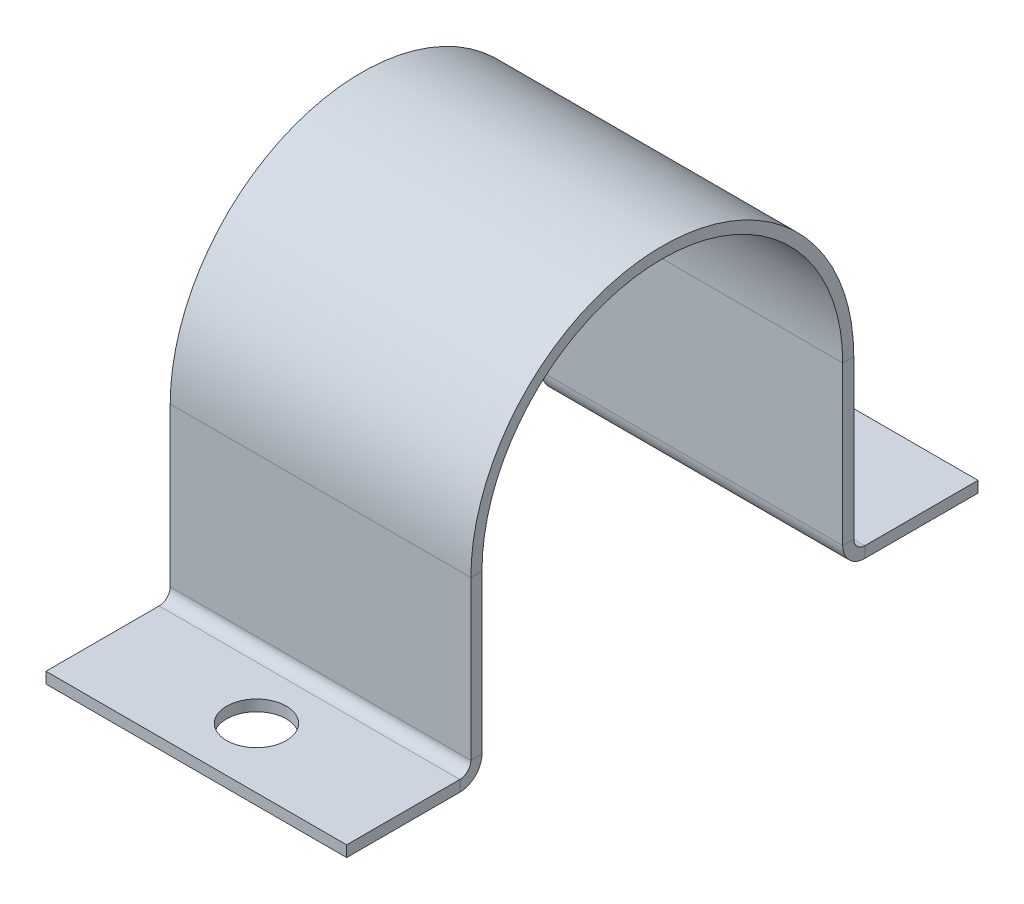
ISO-10303-21;
HEADER;
FILE_DESCRIPTION(('STEP AP214'),'2;1');
FILE_NAME('part.step','',(''),(''),'','','');
FILE_SCHEMA(('AUTOMOTIVE_DESIGN { 1 0 10303 214 1 1 1 1 }'));
ENDSEC;
DATA;
#1=APPLICATION_CONTEXT('core data for automotive mechanical design processes');
#2=APPLICATION_PROTOCOL_DEFINITION('international standard','automotive_design',2000,#1);
#3=PRODUCT_CONTEXT('',#1,'mechanical');
#4=PRODUCT('Part','Part','',(#3));
#5=PRODUCT_RELATED_PRODUCT_CATEGORY('part','',(#4));
#6=PRODUCT_DEFINITION_FORMATION('','',#4);
#7=PRODUCT_DEFINITION_CONTEXT('part definition',#1,'design');
#8=PRODUCT_DEFINITION('design','',#6,#7);
#9=PRODUCT_DEFINITION_SHAPE('','',#8);
#10=(LENGTH_UNIT() NAMED_UNIT(*) SI_UNIT(.MILLI.,.METRE.));
#11=(NAMED_UNIT(*) PLANE_ANGLE_UNIT() SI_UNIT($,.RADIAN.));
#12=(NAMED_UNIT(*) SI_UNIT($,.STERADIAN.) SOLID_ANGLE_UNIT());
#13=UNCERTAINTY_MEASURE_WITH_UNIT(LENGTH_MEASURE(1.E-05),#10,'distance_accuracy_value','');
#14=(GEOMETRIC_REPRESENTATION_CONTEXT(3) GLOBAL_UNCERTAINTY_ASSIGNED_CONTEXT((#13)) GLOBAL_UNIT_ASSIGNED_CONTEXT((#10,
#11,#12)) REPRESENTATION_CONTEXT('',''));
#15=CARTESIAN_POINT('',(0.,0.,0.));
#16=DIRECTION('',(0.,0.,1.));
#17=DIRECTION('',(1.,0.,0.));
#18=AXIS2_PLACEMENT_3D('',#15,#16,#17);
#19=CARTESIAN_POINT('',(10.,0.,-12.));
#20=DIRECTION('',(0.,1.,0.));
#21=DIRECTION('',(0.,0.,1.));
#22=AXIS2_PLACEMENT_3D('',#19,#20,#21);
#23=PLANE('',#22);
#24=DIRECTION('',(0.,0.,-1.));
#25=VECTOR('',#24,1.);
#26=CARTESIAN_POINT('',(-10.,0.,-12.));
#27=LINE('',#26,#25);
#28=CARTESIAN_POINT('',(-10.,0.,-13.4732));
#29=VERTEX_POINT('',#28);
#30=CARTESIAN_POINT('',(-10.,0.,-21.));
#31=VERTEX_POINT('',#30);
#32=EDGE_CURVE('E199',#29,#31,#27,.T.);
#33=ORIENTED_EDGE('',*,*,#32,.T.);
#34=DIRECTION('',(-1.,0.,0.));
#35=VECTOR('',#34,1.);
#36=CARTESIAN_POINT('',(10.,0.,-21.));
#37=LINE('',#36,#35);
#38=CARTESIAN_POINT('',(10.,0.,-21.));
#39=VERTEX_POINT('',#38);
#40=EDGE_CURVE('E276',#39,#31,#37,.T.);
#41=ORIENTED_EDGE('',*,*,#40,.F.);
#42=DIRECTION('',(0.,0.,-1.));
#43=VECTOR('',#42,1.);
#44=CARTESIAN_POINT('',(10.,0.,-12.));
#45=LINE('',#44,#43);
#46=CARTESIAN_POINT('',(10.,0.,-13.4732));
#47=VERTEX_POINT('',#46);
#48=EDGE_CURVE('E121',#47,#39,#45,.T.);
#49=ORIENTED_EDGE('',*,*,#48,.F.);
#50=DIRECTION('',(-1.,0.,0.));
#51=VECTOR('',#50,1.);
#52=CARTESIAN_POINT('',(10.,0.,-13.4732));
#53=LINE('',#52,#51);
#54=EDGE_CURVE('E195',#47,#29,#53,.T.);
#55=ORIENTED_EDGE('',*,*,#54,.T.);
#56=EDGE_LOOP('',(#33,#41,#49,#55));
#57=FACE_BOUND('',#56,.T.);
#58=CARTESIAN_POINT('',(0.,0.,-17.));
#59=DIRECTION('',(0.,-1.,0.));
#60=DIRECTION('',(0.,0.,-1.));
#61=AXIS2_PLACEMENT_3D('',#58,#59,#60);
#62=CIRCLE('',#61,1.984375);
#63=CARTESIAN_POINT('',(0.,0.,-18.984375));
#64=VERTEX_POINT('',#63);
#65=EDGE_CURVE('E729',#64,#64,#62,.T.);
#66=ORIENTED_EDGE('',*,*,#65,.F.);
#67=EDGE_LOOP('',(#66));
#68=FACE_BOUND('',#67,.T.);
#69=ADVANCED_FACE('F38',(#57,#68),#23,.F.);
#70=CARTESIAN_POINT('',(10.,0.736600000000001,-12.));
#71=DIRECTION('',(0.,1.,0.));
#72=DIRECTION('',(0.,0.,1.));
#73=AXIS2_PLACEMENT_3D('',#70,#71,#72);
#74=PLANE('',#73);
#75=DIRECTION('',(0.,0.,-1.));
#76=VECTOR('',#75,1.);
#77=CARTESIAN_POINT('',(-10.,0.736600000000001,-12.));
#78=LINE('',#77,#76);
#79=CARTESIAN_POINT('',(-10.,0.7366,-13.4732));
#80=VERTEX_POINT('',#79);
#81=CARTESIAN_POINT('',(-10.,0.7366,-21.));
#82=VERTEX_POINT('',#81);
#83=EDGE_CURVE('E206',#80,#82,#78,.T.);
#84=ORIENTED_EDGE('',*,*,#83,.F.);
#85=DIRECTION('',(-1.,0.,0.));
#86=VECTOR('',#85,1.);
#87=CARTESIAN_POINT('',(10.,0.7366,-13.4732));
#88=LINE('',#87,#86);
#89=CARTESIAN_POINT('',(10.,0.7366,-13.4732));
#90=VERTEX_POINT('',#89);
#91=EDGE_CURVE('E271',#90,#80,#88,.T.);
#92=ORIENTED_EDGE('',*,*,#91,.F.);
#93=DIRECTION('',(0.,0.,-1.));
#94=VECTOR('',#93,1.);
#95=CARTESIAN_POINT('',(10.,0.736600000000001,-12.));
#96=LINE('',#95,#94);
#97=CARTESIAN_POINT('',(10.,0.7366,-21.));
#98=VERTEX_POINT('',#97);
#99=EDGE_CURVE('E720',#90,#98,#96,.T.);
#100=ORIENTED_EDGE('',*,*,#99,.T.);
#101=DIRECTION('',(-1.,0.,0.));
#102=VECTOR('',#101,1.);
#103=CARTESIAN_POINT('',(10.,0.7366,-21.));
#104=LINE('',#103,#102);
#105=EDGE_CURVE('E274',#98,#82,#104,.T.);
#106=ORIENTED_EDGE('',*,*,#105,.T.);
#107=EDGE_LOOP('',(#84,#92,#100,#106));
#108=FACE_BOUND('',#107,.T.);
#109=CARTESIAN_POINT('',(0.,0.7366,-17.));
#110=DIRECTION('',(0.,-1.,0.));
#111=DIRECTION('',(0.,0.,-1.));
#112=AXIS2_PLACEMENT_3D('',#109,#110,#111);
#113=CIRCLE('',#112,1.984375);
#114=CARTESIAN_POINT('',(0.,0.7366,-18.984375));
#115=VERTEX_POINT('',#114);
#116=EDGE_CURVE('E732',#115,#115,#113,.T.);
#117=ORIENTED_EDGE('',*,*,#116,.T.);
#118=EDGE_LOOP('',(#117));
#119=FACE_BOUND('',#118,.T.);
#120=ADVANCED_FACE('F388',(#108,#119),#74,.T.);
#121=CARTESIAN_POINT('',(10.,12.,12.));
#122=DIRECTION('',(1.,0.,0.));
#123=DIRECTION('',(0.,0.,-1.));
#124=AXIS2_PLACEMENT_3D('',#121,#122,#123);
#125=PLANE('',#124);
#126=DIRECTION('',(0.,0.,1.));
#127=VECTOR('',#126,1.);
#128=CARTESIAN_POINT('',(10.,12.,12.));
#129=LINE('',#128,#127);
#130=CARTESIAN_POINT('',(10.,12.,12.));
#131=VERTEX_POINT('',#130);
#132=CARTESIAN_POINT('',(10.,12.,12.7366));
#133=VERTEX_POINT('',#132);
#134=EDGE_CURVE('E11',#131,#133,#129,.T.);
#135=ORIENTED_EDGE('',*,*,#134,.F.);
#136=CARTESIAN_POINT('',(10.,12.,0.));
#137=DIRECTION('',(-1.,0.,0.));
#138=DIRECTION('',(0.,0.,1.));
#139=AXIS2_PLACEMENT_3D('',#136,#137,#138);
#140=CIRCLE('',#139,12.);
#141=CARTESIAN_POINT('',(10.,12.,-12.));
#142=VERTEX_POINT('',#141);
#143=EDGE_CURVE('E173',#131,#142,#140,.T.);
#144=ORIENTED_EDGE('',*,*,#143,.T.);
#145=DIRECTION('',(0.,0.,1.));
#146=VECTOR('',#145,1.);
#147=CARTESIAN_POINT('',(10.,12.,-12.7366));
#148=LINE('',#147,#146);
#149=CARTESIAN_POINT('',(10.,12.,-12.7366));
#150=VERTEX_POINT('',#149);
#151=EDGE_CURVE('E47',#150,#142,#148,.T.);
#152=ORIENTED_EDGE('',*,*,#151,.F.);
#153=CARTESIAN_POINT('',(10.,12.,0.));
#154=DIRECTION('',(1.,0.,0.));
#155=DIRECTION('',(0.,0.,-1.));
#156=AXIS2_PLACEMENT_3D('',#153,#154,#155);
#157=CIRCLE('',#156,12.7366);
#158=EDGE_CURVE('E300',#133,#150,#157,.F.);
#159=ORIENTED_EDGE('',*,*,#158,.F.);
#160=EDGE_LOOP('',(#135,#144,#152,#159));
#161=FACE_BOUND('',#160,.T.);
#162=ADVANCED_FACE('F40',(#161),#125,.T.);
#163=CARTESIAN_POINT('',(10.,12.,-12.7366));
#164=DIRECTION('',(1.,0.,0.));
#165=DIRECTION('',(0.,0.,-1.));
#166=AXIS2_PLACEMENT_3D('',#163,#164,#165);
#167=PLANE('',#166);
#168=DIRECTION('',(0.,1.,0.));
#169=VECTOR('',#168,1.);
#170=CARTESIAN_POINT('',(10.,0.,12.));
#171=LINE('',#170,#169);
#172=CARTESIAN_POINT('',(10.,1.4732,12.));
#173=VERTEX_POINT('',#172);
#174=EDGE_CURVE('E178',#173,#131,#171,.T.);
#175=ORIENTED_EDGE('',*,*,#174,.T.);
#176=ORIENTED_EDGE('',*,*,#134,.T.);
#177=DIRECTION('',(0.,1.,0.));
#178=VECTOR('',#177,1.);
#179=CARTESIAN_POINT('',(10.,0.,12.7366));
#180=LINE('',#179,#178);
#181=CARTESIAN_POINT('',(10.,1.4732,12.7366));
#182=VERTEX_POINT('',#181);
#183=EDGE_CURVE('E314',#182,#133,#180,.T.);
#184=ORIENTED_EDGE('',*,*,#183,.F.);
#185=DIRECTION('',(0.,0.,-1.));
#186=VECTOR('',#185,1.);
#187=CARTESIAN_POINT('',(10.,1.4732,12.7366));
#188=LINE('',#187,#186);
#189=EDGE_CURVE('E287',#182,#173,#188,.T.);
#190=ORIENTED_EDGE('',*,*,#189,.T.);
#191=EDGE_LOOP('',(#175,#176,#184,#190));
#192=FACE_BOUND('',#191,.T.);
#193=ADVANCED_FACE('F338',(#192),#167,.T.);
#194=CARTESIAN_POINT('',(-10.,12.,-12.));
#195=DIRECTION('',(-1.,0.,0.));
#196=DIRECTION('',(0.,0.,1.));
#197=AXIS2_PLACEMENT_3D('',#194,#195,#196);
#198=PLANE('',#197);
#199=DIRECTION('',(0.,0.,-1.));
#200=VECTOR('',#199,1.);
#201=CARTESIAN_POINT('',(-10.,12.,-12.));
#202=LINE('',#201,#200);
#203=CARTESIAN_POINT('',(-10.,12.,-12.));
#204=VERTEX_POINT('',#203);
#205=CARTESIAN_POINT('',(-10.,12.,-12.7366));
#206=VERTEX_POINT('',#205);
#207=EDGE_CURVE('E171',#204,#206,#202,.T.);
#208=ORIENTED_EDGE('',*,*,#207,.F.);
#209=CARTESIAN_POINT('',(-10.,12.,0.));
#210=DIRECTION('',(-1.,0.,0.));
#211=DIRECTION('',(0.,0.,1.));
#212=AXIS2_PLACEMENT_3D('',#209,#210,#211);
#213=CIRCLE('',#212,12.);
#214=CARTESIAN_POINT('',(-10.,12.,12.));
#215=VERTEX_POINT('',#214);
#216=EDGE_CURVE('E185',#215,#204,#213,.T.);
#217=ORIENTED_EDGE('',*,*,#216,.F.);
#218=DIRECTION('',(0.,0.,-1.));
#219=VECTOR('',#218,1.);
#220=CARTESIAN_POINT('',(-10.,12.,12.7366));
#221=LINE('',#220,#219);
#222=CARTESIAN_POINT('',(-10.,12.,12.7366));
#223=VERTEX_POINT('',#222);
#224=EDGE_CURVE('E291',#223,#215,#221,.T.);
#225=ORIENTED_EDGE('',*,*,#224,.F.);
#226=CARTESIAN_POINT('',(-10.,12.,0.));
#227=DIRECTION('',(1.,0.,0.));
#228=DIRECTION('',(0.,0.,-1.));
#229=AXIS2_PLACEMENT_3D('',#226,#227,#228);
#230=CIRCLE('',#229,12.7366);
#231=EDGE_CURVE('E213',#223,#206,#230,.F.);
#232=ORIENTED_EDGE('',*,*,#231,.T.);
#233=EDGE_LOOP('',(#208,#217,#225,#232));
#234=FACE_BOUND('',#233,.T.);
#235=ADVANCED_FACE('F305',(#234),#198,.T.);
#236=CARTESIAN_POINT('',(-10.,12.,12.7366));
#237=DIRECTION('',(-1.,0.,0.));
#238=DIRECTION('',(0.,0.,1.));
#239=AXIS2_PLACEMENT_3D('',#236,#237,#238);
#240=PLANE('',#239);
#241=DIRECTION('',(0.,-1.,0.));
#242=VECTOR('',#241,1.);
#243=CARTESIAN_POINT('',(-10.,12.,-12.));
#244=LINE('',#243,#242);
#245=CARTESIAN_POINT('',(-10.,1.4732,-12.));
#246=VERTEX_POINT('',#245);
#247=EDGE_CURVE('E238',#204,#246,#244,.T.);
#248=ORIENTED_EDGE('',*,*,#247,.F.);
#249=ORIENTED_EDGE('',*,*,#207,.T.);
#250=DIRECTION('',(0.,-1.,0.));
#251=VECTOR('',#250,1.);
#252=CARTESIAN_POINT('',(-10.,12.,-12.7366));
#253=LINE('',#252,#251);
#254=CARTESIAN_POINT('',(-10.,1.4732,-12.7366));
#255=VERTEX_POINT('',#254);
#256=EDGE_CURVE('E211',#206,#255,#253,.T.);
#257=ORIENTED_EDGE('',*,*,#256,.T.);
#258=DIRECTION('',(0.,0.,1.));
#259=VECTOR('',#258,1.);
#260=CARTESIAN_POINT('',(-10.,1.4732,-12.7366));
#261=LINE('',#260,#259);
#262=EDGE_CURVE('E108',#255,#246,#261,.T.);
#263=ORIENTED_EDGE('',*,*,#262,.T.);
#264=EDGE_LOOP('',(#248,#249,#257,#263));
#265=FACE_BOUND('',#264,.T.);
#266=ADVANCED_FACE('F293',(#265),#240,.T.);
#267=CARTESIAN_POINT('',(10.,0.,13.4732));
#268=DIRECTION('',(1.,0.,0.));
#269=DIRECTION('',(0.,0.,-1.));
#270=AXIS2_PLACEMENT_3D('',#267,#268,#269);
#271=PLANE('',#270);
#272=DIRECTION('',(0.,1.,0.));
#273=VECTOR('',#272,1.);
#274=CARTESIAN_POINT('',(10.,0.,13.4732));
#275=LINE('',#274,#273);
#276=CARTESIAN_POINT('',(10.,0.,13.4732));
#277=VERTEX_POINT('',#276);
#278=CARTESIAN_POINT('',(10.,0.7366,13.4732));
#279=VERTEX_POINT('',#278);
#280=EDGE_CURVE('E289',#277,#279,#275,.T.);
#281=ORIENTED_EDGE('',*,*,#280,.F.);
#282=CARTESIAN_POINT('',(10.,1.4732,13.4732));
#283=DIRECTION('',(-1.,0.,0.));
#284=DIRECTION('',(0.,0.,1.));
#285=AXIS2_PLACEMENT_3D('',#282,#283,#284);
#286=CIRCLE('',#285,1.4732);
#287=EDGE_CURVE('E333',#277,#173,#286,.F.);
#288=ORIENTED_EDGE('',*,*,#287,.T.);
#289=ORIENTED_EDGE('',*,*,#189,.F.);
#290=CARTESIAN_POINT('',(10.,1.4732,13.4732));
#291=DIRECTION('',(1.,0.,0.));
#292=DIRECTION('',(0.,0.,-1.));
#293=AXIS2_PLACEMENT_3D('',#290,#291,#292);
#294=CIRCLE('',#293,0.7366);
#295=EDGE_CURVE('E316',#279,#182,#294,.T.);
#296=ORIENTED_EDGE('',*,*,#295,.F.);
#297=EDGE_LOOP('',(#281,#288,#289,#296));
#298=FACE_BOUND('',#297,.T.);
#299=ADVANCED_FACE('F351',(#298),#271,.T.);
#300=CARTESIAN_POINT('',(10.,1.4732,12.7366));
#301=DIRECTION('',(1.,0.,0.));
#302=DIRECTION('',(0.,0.,-1.));
#303=AXIS2_PLACEMENT_3D('',#300,#301,#302);
#304=PLANE('',#303);
#305=DIRECTION('',(0.,0.,-1.));
#306=VECTOR('',#305,1.);
#307=CARTESIAN_POINT('',(10.,0.,21.));
#308=LINE('',#307,#306);
#309=CARTESIAN_POINT('',(10.,0.,21.));
#310=VERTEX_POINT('',#309);
#311=EDGE_CURVE('E330',#310,#277,#308,.T.);
#312=ORIENTED_EDGE('',*,*,#311,.T.);
#313=ORIENTED_EDGE('',*,*,#280,.T.);
#314=DIRECTION('',(0.,0.,-1.));
#315=VECTOR('',#314,1.);
#316=CARTESIAN_POINT('',(10.,0.7366,21.));
#317=LINE('',#316,#315);
#318=CARTESIAN_POINT('',(10.,0.7366,21.));
#319=VERTEX_POINT('',#318);
#320=EDGE_CURVE('E324',#319,#279,#317,.T.);
#321=ORIENTED_EDGE('',*,*,#320,.F.);
#322=DIRECTION('',(0.,1.,0.));
#323=VECTOR('',#322,1.);
#324=CARTESIAN_POINT('',(10.,0.,21.));
#325=LINE('',#324,#323);
#326=EDGE_CURVE('E327',#310,#319,#325,.T.);
#327=ORIENTED_EDGE('',*,*,#326,.F.);
#328=EDGE_LOOP('',(#312,#313,#321,#327));
#329=FACE_BOUND('',#328,.T.);
#330=ADVANCED_FACE('F358',(#329),#304,.T.);
#331=CARTESIAN_POINT('',(-10.,1.4732,12.));
#332=DIRECTION('',(-1.,0.,0.));
#333=DIRECTION('',(0.,0.,1.));
#334=AXIS2_PLACEMENT_3D('',#331,#332,#333);
#335=PLANE('',#334);
#336=DIRECTION('',(0.,0.,1.));
#337=VECTOR('',#336,1.);
#338=CARTESIAN_POINT('',(-10.,1.4732,12.));
#339=LINE('',#338,#337);
#340=CARTESIAN_POINT('',(-10.,1.4732,12.));
#341=VERTEX_POINT('',#340);
#342=CARTESIAN_POINT('',(-10.,1.4732,12.7366));
#343=VERTEX_POINT('',#342);
#344=EDGE_CURVE('E285',#341,#343,#339,.T.);
#345=ORIENTED_EDGE('',*,*,#344,.F.);
#346=CARTESIAN_POINT('',(-10.,1.4732,13.4732));
#347=DIRECTION('',(-1.,0.,0.));
#348=DIRECTION('',(0.,0.,1.));
#349=AXIS2_PLACEMENT_3D('',#346,#347,#348);
#350=CIRCLE('',#349,1.4732);
#351=CARTESIAN_POINT('',(-10.,0.,13.4732));
#352=VERTEX_POINT('',#351);
#353=EDGE_CURVE('E231',#352,#341,#350,.F.);
#354=ORIENTED_EDGE('',*,*,#353,.F.);
#355=DIRECTION('',(0.,-1.,0.));
#356=VECTOR('',#355,1.);
#357=CARTESIAN_POINT('',(-10.,0.7366,13.4732));
#358=LINE('',#357,#356);
#359=CARTESIAN_POINT('',(-10.,0.7366,13.4732));
#360=VERTEX_POINT('',#359);
#361=EDGE_CURVE('E283',#360,#352,#358,.T.);
#362=ORIENTED_EDGE('',*,*,#361,.F.);
#363=CARTESIAN_POINT('',(-10.,1.4732,13.4732));
#364=DIRECTION('',(1.,0.,0.));
#365=DIRECTION('',(0.,0.,-1.));
#366=AXIS2_PLACEMENT_3D('',#363,#364,#365);
#367=CIRCLE('',#366,0.7366);
#368=EDGE_CURVE('E219',#360,#343,#367,.T.);
#369=ORIENTED_EDGE('',*,*,#368,.T.);
#370=EDGE_LOOP('',(#345,#354,#362,#369));
#371=FACE_BOUND('',#370,.T.);
#372=ADVANCED_FACE('F370',(#371),#335,.T.);
#373=CARTESIAN_POINT('',(-10.,0.7366,13.4732));
#374=DIRECTION('',(-1.,0.,0.));
#375=DIRECTION('',(0.,0.,1.));
#376=AXIS2_PLACEMENT_3D('',#373,#374,#375);
#377=PLANE('',#376);
#378=DIRECTION('',(0.,1.,0.));
#379=VECTOR('',#378,1.);
#380=CARTESIAN_POINT('',(-10.,0.,12.));
#381=LINE('',#380,#379);
#382=EDGE_CURVE('E234',#341,#215,#381,.T.);
#383=ORIENTED_EDGE('',*,*,#382,.F.);
#384=ORIENTED_EDGE('',*,*,#344,.T.);
#385=DIRECTION('',(0.,1.,0.));
#386=VECTOR('',#385,1.);
#387=CARTESIAN_POINT('',(-10.,0.,12.7366));
#388=LINE('',#387,#386);
#389=EDGE_CURVE('E216',#343,#223,#388,.T.);
#390=ORIENTED_EDGE('',*,*,#389,.T.);
#391=ORIENTED_EDGE('',*,*,#224,.T.);
#392=EDGE_LOOP('',(#383,#384,#390,#391));
#393=FACE_BOUND('',#392,.T.);
#394=ADVANCED_FACE('F342',(#393),#377,.T.);
#395=CARTESIAN_POINT('',(10.,1.4732,-12.));
#396=DIRECTION('',(1.,0.,0.));
#397=DIRECTION('',(0.,0.,-1.));
#398=AXIS2_PLACEMENT_3D('',#395,#396,#397);
#399=PLANE('',#398);
#400=DIRECTION('',(0.,0.,-1.));
#401=VECTOR('',#400,1.);
#402=CARTESIAN_POINT('',(10.,1.4732,-12.));
#403=LINE('',#402,#401);
#404=CARTESIAN_POINT('',(10.,1.4732,-12.));
#405=VERTEX_POINT('',#404);
#406=CARTESIAN_POINT('',(10.,1.4732,-12.7366));
#407=VERTEX_POINT('',#406);
#408=EDGE_CURVE('E281',#405,#407,#403,.T.);
#409=ORIENTED_EDGE('',*,*,#408,.F.);
#410=CARTESIAN_POINT('',(10.,1.4732,-13.4732));
#411=DIRECTION('',(-1.,0.,0.));
#412=DIRECTION('',(0.,0.,1.));
#413=AXIS2_PLACEMENT_3D('',#410,#411,#412);
#414=CIRCLE('',#413,1.4732);
#415=EDGE_CURVE('E193',#405,#47,#414,.F.);
#416=ORIENTED_EDGE('',*,*,#415,.T.);
#417=DIRECTION('',(0.,-1.,0.));
#418=VECTOR('',#417,1.);
#419=CARTESIAN_POINT('',(10.,0.7366,-13.4732));
#420=LINE('',#419,#418);
#421=EDGE_CURVE('E55',#90,#47,#420,.T.);
#422=ORIENTED_EDGE('',*,*,#421,.F.);
#423=CARTESIAN_POINT('',(10.,1.4732,-13.4732));
#424=DIRECTION('',(1.,0.,0.));
#425=DIRECTION('',(0.,0.,-1.));
#426=AXIS2_PLACEMENT_3D('',#423,#424,#425);
#427=CIRCLE('',#426,0.7366);
#428=EDGE_CURVE('E318',#407,#90,#427,.T.);
#429=ORIENTED_EDGE('',*,*,#428,.F.);
#430=EDGE_LOOP('',(#409,#416,#422,#429));
#431=FACE_BOUND('',#430,.T.);
#432=ADVANCED_FACE('F409',(#431),#399,.T.);
#433=CARTESIAN_POINT('',(10.,0.7366,-13.4732));
#434=DIRECTION('',(1.,0.,0.));
#435=DIRECTION('',(0.,0.,-1.));
#436=AXIS2_PLACEMENT_3D('',#433,#434,#435);
#437=PLANE('',#436);
#438=DIRECTION('',(0.,-1.,0.));
#439=VECTOR('',#438,1.);
#440=CARTESIAN_POINT('',(10.,12.,-12.));
#441=LINE('',#440,#439);
#442=EDGE_CURVE('E163',#142,#405,#441,.T.);
#443=ORIENTED_EDGE('',*,*,#442,.T.);
#444=ORIENTED_EDGE('',*,*,#408,.T.);
#445=DIRECTION('',(0.,-1.,0.));
#446=VECTOR('',#445,1.);
#447=CARTESIAN_POINT('',(10.,12.,-12.7366));
#448=LINE('',#447,#446);
#449=EDGE_CURVE('E166',#150,#407,#448,.T.);
#450=ORIENTED_EDGE('',*,*,#449,.F.);
#451=ORIENTED_EDGE('',*,*,#151,.T.);
#452=EDGE_LOOP('',(#443,#444,#450,#451));
#453=FACE_BOUND('',#452,.T.);
#454=ADVANCED_FACE('F161',(#453),#437,.T.);
#455=CARTESIAN_POINT('',(-10.,0.,-13.4732));
#456=DIRECTION('',(-1.,0.,0.));
#457=DIRECTION('',(0.,0.,1.));
#458=AXIS2_PLACEMENT_3D('',#455,#456,#457);
#459=PLANE('',#458);
#460=DIRECTION('',(0.,1.,0.));
#461=VECTOR('',#460,1.);
#462=CARTESIAN_POINT('',(-10.,0.,-13.4732));
#463=LINE('',#462,#461);
#464=EDGE_CURVE('E115',#29,#80,#463,.T.);
#465=ORIENTED_EDGE('',*,*,#464,.F.);
#466=CARTESIAN_POINT('',(-10.,1.4732,-13.4732));
#467=DIRECTION('',(-1.,0.,0.));
#468=DIRECTION('',(0.,0.,1.));
#469=AXIS2_PLACEMENT_3D('',#466,#467,#468);
#470=CIRCLE('',#469,1.4732);
#471=EDGE_CURVE('E240',#246,#29,#470,.F.);
#472=ORIENTED_EDGE('',*,*,#471,.F.);
#473=ORIENTED_EDGE('',*,*,#262,.F.);
#474=CARTESIAN_POINT('',(-10.,1.4732,-13.4732));
#475=DIRECTION('',(1.,0.,0.));
#476=DIRECTION('',(0.,0.,-1.));
#477=AXIS2_PLACEMENT_3D('',#474,#475,#476);
#478=CIRCLE('',#477,0.7366);
#479=EDGE_CURVE('E209',#255,#80,#478,.T.);
#480=ORIENTED_EDGE('',*,*,#479,.T.);
#481=EDGE_LOOP('',(#465,#472,#473,#480));
#482=FACE_BOUND('',#481,.T.);
#483=ADVANCED_FACE('F403',(#482),#459,.T.);
#484=CARTESIAN_POINT('',(-10.,1.4732,-12.7366));
#485=DIRECTION('',(-1.,0.,0.));
#486=DIRECTION('',(0.,0.,1.));
#487=AXIS2_PLACEMENT_3D('',#484,#485,#486);
#488=PLANE('',#487);
#489=ORIENTED_EDGE('',*,*,#32,.F.);
#490=ORIENTED_EDGE('',*,*,#464,.T.);
#491=ORIENTED_EDGE('',*,*,#83,.T.);
#492=DIRECTION('',(0.,-1.,0.));
#493=VECTOR('',#492,1.);
#494=CARTESIAN_POINT('',(-10.,0.7366,-21.));
#495=LINE('',#494,#493);
#496=EDGE_CURVE('E202',#82,#31,#495,.T.);
#497=ORIENTED_EDGE('',*,*,#496,.T.);
#498=EDGE_LOOP('',(#489,#490,#491,#497));
#499=FACE_BOUND('',#498,.T.);
#500=ADVANCED_FACE('F400',(#499),#488,.T.);
#501=CARTESIAN_POINT('',(10.,0.7366,-21.));
#502=DIRECTION('',(0.,0.,-1.));
#503=DIRECTION('',(-1.,0.,0.));
#504=AXIS2_PLACEMENT_3D('',#501,#502,#503);
#505=PLANE('',#504);
#506=ORIENTED_EDGE('',*,*,#496,.F.);
#507=ORIENTED_EDGE('',*,*,#105,.F.);
#508=DIRECTION('',(0.,-1.,0.));
#509=VECTOR('',#508,1.);
#510=CARTESIAN_POINT('',(10.,0.7366,-21.));
#511=LINE('',#510,#509);
#512=EDGE_CURVE('E721',#98,#39,#511,.T.);
#513=ORIENTED_EDGE('',*,*,#512,.T.);
#514=ORIENTED_EDGE('',*,*,#40,.T.);
#515=EDGE_LOOP('',(#506,#507,#513,#514));
#516=FACE_BOUND('',#515,.T.);
#517=ADVANCED_FACE('F399',(#516),#505,.T.);
#518=CARTESIAN_POINT('',(10.,1.4732,-13.4732));
#519=DIRECTION('',(-1.,0.,0.));
#520=DIRECTION('',(0.,0.,1.));
#521=AXIS2_PLACEMENT_3D('',#518,#519,#520);
#522=CYLINDRICAL_SURFACE('',#521,0.7366);
#523=ORIENTED_EDGE('',*,*,#479,.F.);
#524=DIRECTION('',(-1.,0.,0.));
#525=VECTOR('',#524,1.);
#526=CARTESIAN_POINT('',(10.,1.4732,-12.7366));
#527=LINE('',#526,#525);
#528=EDGE_CURVE('E268',#407,#255,#527,.T.);
#529=ORIENTED_EDGE('',*,*,#528,.F.);
#530=ORIENTED_EDGE('',*,*,#428,.T.);
#531=ORIENTED_EDGE('',*,*,#91,.T.);
#532=EDGE_LOOP('',(#523,#529,#530,#531));
#533=FACE_BOUND('',#532,.T.);
#534=ADVANCED_FACE('F580',(#533),#522,.F.);
#535=CARTESIAN_POINT('',(10.,12.,-12.7366));
#536=DIRECTION('',(0.,0.,-1.));
#537=DIRECTION('',(0.,1.,0.));
#538=AXIS2_PLACEMENT_3D('',#535,#536,#537);
#539=PLANE('',#538);
#540=ORIENTED_EDGE('',*,*,#256,.F.);
#541=DIRECTION('',(-1.,0.,0.));
#542=VECTOR('',#541,1.);
#543=CARTESIAN_POINT('',(10.,12.,-12.7366));
#544=LINE('',#543,#542);
#545=EDGE_CURVE('E265',#150,#206,#544,.T.);
#546=ORIENTED_EDGE('',*,*,#545,.F.);
#547=ORIENTED_EDGE('',*,*,#449,.T.);
#548=ORIENTED_EDGE('',*,*,#528,.T.);
#549=EDGE_LOOP('',(#540,#546,#547,#548));
#550=FACE_BOUND('',#549,.T.);
#551=ADVANCED_FACE('F302',(#550),#539,.T.);
#552=CARTESIAN_POINT('',(10.,12.,0.));
#553=DIRECTION('',(-1.,0.,0.));
#554=DIRECTION('',(0.,0.,1.));
#555=AXIS2_PLACEMENT_3D('',#552,#553,#554);
#556=CYLINDRICAL_SURFACE('',#555,12.7366);
#557=ORIENTED_EDGE('',*,*,#231,.F.);
#558=DIRECTION('',(-1.,0.,0.));
#559=VECTOR('',#558,1.);
#560=CARTESIAN_POINT('',(10.,12.,12.7366));
#561=LINE('',#560,#559);
#562=EDGE_CURVE('E262',#133,#223,#561,.T.);
#563=ORIENTED_EDGE('',*,*,#562,.F.);
#564=ORIENTED_EDGE('',*,*,#158,.T.);
#565=ORIENTED_EDGE('',*,*,#545,.T.);
#566=EDGE_LOOP('',(#557,#563,#564,#565));
#567=FACE_BOUND('',#566,.T.);
#568=ADVANCED_FACE('F298',(#567),#556,.T.);
#569=CARTESIAN_POINT('',(10.,0.,12.7366));
#570=DIRECTION('',(0.,0.,1.));
#571=DIRECTION('',(0.,-1.,0.));
#572=AXIS2_PLACEMENT_3D('',#569,#570,#571);
#573=PLANE('',#572);
#574=ORIENTED_EDGE('',*,*,#389,.F.);
#575=DIRECTION('',(-1.,0.,0.));
#576=VECTOR('',#575,1.);
#577=CARTESIAN_POINT('',(10.,1.4732,12.7366));
#578=LINE('',#577,#576);
#579=EDGE_CURVE('E259',#182,#343,#578,.T.);
#580=ORIENTED_EDGE('',*,*,#579,.F.);
#581=ORIENTED_EDGE('',*,*,#183,.T.);
#582=ORIENTED_EDGE('',*,*,#562,.T.);
#583=EDGE_LOOP('',(#574,#580,#581,#582));
#584=FACE_BOUND('',#583,.T.);
#585=ADVANCED_FACE('F311',(#584),#573,.T.);
#586=CARTESIAN_POINT('',(10.,1.4732,13.4732));
#587=DIRECTION('',(-1.,0.,0.));
#588=DIRECTION('',(0.,0.,1.));
#589=AXIS2_PLACEMENT_3D('',#586,#587,#588);
#590=CYLINDRICAL_SURFACE('',#589,0.7366);
#591=ORIENTED_EDGE('',*,*,#368,.F.);
#592=DIRECTION('',(-1.,0.,0.));
#593=VECTOR('',#592,1.);
#594=CARTESIAN_POINT('',(10.,0.7366,13.4732));
#595=LINE('',#594,#593);
#596=EDGE_CURVE('E256',#279,#360,#595,.T.);
#597=ORIENTED_EDGE('',*,*,#596,.F.);
#598=ORIENTED_EDGE('',*,*,#295,.T.);
#599=ORIENTED_EDGE('',*,*,#579,.T.);
#600=EDGE_LOOP('',(#591,#597,#598,#599));
#601=FACE_BOUND('',#600,.T.);
#602=ADVANCED_FACE('F347',(#601),#590,.F.);
#603=CARTESIAN_POINT('',(10.,0.7366,21.));
#604=DIRECTION('',(0.,1.,0.));
#605=DIRECTION('',(0.,0.,1.));
#606=AXIS2_PLACEMENT_3D('',#603,#604,#605);
#607=PLANE('',#606);
#608=CARTESIAN_POINT('',(0.,0.7366,17.));
#609=DIRECTION('',(0.,1.,0.));
#610=DIRECTION('',(0.,0.,1.));
#611=AXIS2_PLACEMENT_3D('',#608,#609,#610);
#612=CIRCLE('',#611,1.984375);
#613=CARTESIAN_POINT('',(0.,0.7366,18.984375));
#614=VERTEX_POINT('',#613);
#615=EDGE_CURVE('E726',#614,#614,#612,.T.);
#616=ORIENTED_EDGE('',*,*,#615,.F.);
#617=EDGE_LOOP('',(#616));
#618=FACE_BOUND('',#617,.T.);
#619=DIRECTION('',(0.,0.,-1.));
#620=VECTOR('',#619,1.);
#621=CARTESIAN_POINT('',(-10.,0.7366,21.));
#622=LINE('',#621,#620);
#623=CARTESIAN_POINT('',(-10.,0.7366,21.));
#624=VERTEX_POINT('',#623);
#625=EDGE_CURVE('E222',#624,#360,#622,.T.);
#626=ORIENTED_EDGE('',*,*,#625,.F.);
#627=DIRECTION('',(-1.,0.,0.));
#628=VECTOR('',#627,1.);
#629=CARTESIAN_POINT('',(10.,0.7366,21.));
#630=LINE('',#629,#628);
#631=EDGE_CURVE('E254',#319,#624,#630,.T.);
#632=ORIENTED_EDGE('',*,*,#631,.F.);
#633=ORIENTED_EDGE('',*,*,#320,.T.);
#634=ORIENTED_EDGE('',*,*,#596,.T.);
#635=EDGE_LOOP('',(#626,#632,#633,#634));
#636=FACE_BOUND('',#635,.T.);
#637=ADVANCED_FACE('F355',(#618,#636),#607,.T.);
#638=CARTESIAN_POINT('',(10.,0.,21.));
#639=DIRECTION('',(0.,0.,1.));
#640=DIRECTION('',(1.,0.,0.));
#641=AXIS2_PLACEMENT_3D('',#638,#639,#640);
#642=PLANE('',#641);
#643=DIRECTION('',(0.,1.,0.));
#644=VECTOR('',#643,1.);
#645=CARTESIAN_POINT('',(-10.,0.,21.));
#646=LINE('',#645,#644);
#647=CARTESIAN_POINT('',(-10.,0.,21.));
#648=VERTEX_POINT('',#647);
#649=EDGE_CURVE('E225',#648,#624,#646,.T.);
#650=ORIENTED_EDGE('',*,*,#649,.F.);
#651=DIRECTION('',(-1.,0.,0.));
#652=VECTOR('',#651,1.);
#653=CARTESIAN_POINT('',(10.,0.,21.));
#654=LINE('',#653,#652);
#655=EDGE_CURVE('E252',#310,#648,#654,.T.);
#656=ORIENTED_EDGE('',*,*,#655,.F.);
#657=ORIENTED_EDGE('',*,*,#326,.T.);
#658=ORIENTED_EDGE('',*,*,#631,.T.);
#659=EDGE_LOOP('',(#650,#656,#657,#658));
#660=FACE_BOUND('',#659,.T.);
#661=ADVANCED_FACE('F361',(#660),#642,.T.);
#662=CARTESIAN_POINT('',(10.,0.,21.));
#663=DIRECTION('',(0.,1.,0.));
#664=DIRECTION('',(0.,0.,1.));
#665=AXIS2_PLACEMENT_3D('',#662,#663,#664);
#666=PLANE('',#665);
#667=CARTESIAN_POINT('',(0.,0.,17.));
#668=DIRECTION('',(0.,1.,0.));
#669=DIRECTION('',(0.,0.,1.));
#670=AXIS2_PLACEMENT_3D('',#667,#668,#669);
#671=CIRCLE('',#670,1.984375);
#672=CARTESIAN_POINT('',(0.,0.,18.984375));
#673=VERTEX_POINT('',#672);
#674=EDGE_CURVE('E203',#673,#673,#671,.T.);
#675=ORIENTED_EDGE('',*,*,#674,.T.);
#676=EDGE_LOOP('',(#675));
#677=FACE_BOUND('',#676,.T.);
#678=DIRECTION('',(0.,0.,-1.));
#679=VECTOR('',#678,1.);
#680=CARTESIAN_POINT('',(-10.,0.,21.));
#681=LINE('',#680,#679);
#682=EDGE_CURVE('E228',#648,#352,#681,.T.);
#683=ORIENTED_EDGE('',*,*,#682,.T.);
#684=DIRECTION('',(-1.,0.,0.));
#685=VECTOR('',#684,1.);
#686=CARTESIAN_POINT('',(10.,0.,13.4732));
#687=LINE('',#686,#685);
#688=EDGE_CURVE('E249',#277,#352,#687,.T.);
#689=ORIENTED_EDGE('',*,*,#688,.F.);
#690=ORIENTED_EDGE('',*,*,#311,.F.);
#691=ORIENTED_EDGE('',*,*,#655,.T.);
#692=EDGE_LOOP('',(#683,#689,#690,#691));
#693=FACE_BOUND('',#692,.T.);
#694=ADVANCED_FACE('F366',(#677,#693),#666,.F.);
#695=CARTESIAN_POINT('',(10.,1.4732,13.4732));
#696=DIRECTION('',(-1.,0.,0.));
#697=DIRECTION('',(0.,0.,1.));
#698=AXIS2_PLACEMENT_3D('',#695,#696,#697);
#699=CYLINDRICAL_SURFACE('',#698,1.4732);
#700=ORIENTED_EDGE('',*,*,#353,.T.);
#701=DIRECTION('',(-1.,0.,0.));
#702=VECTOR('',#701,1.);
#703=CARTESIAN_POINT('',(10.,1.4732,12.));
#704=LINE('',#703,#702);
#705=EDGE_CURVE('E246',#173,#341,#704,.T.);
#706=ORIENTED_EDGE('',*,*,#705,.F.);
#707=ORIENTED_EDGE('',*,*,#287,.F.);
#708=ORIENTED_EDGE('',*,*,#688,.T.);
#709=EDGE_LOOP('',(#700,#706,#707,#708));
#710=FACE_BOUND('',#709,.T.);
#711=ADVANCED_FACE('F369',(#710),#699,.T.);
#712=CARTESIAN_POINT('',(10.,0.,12.));
#713=DIRECTION('',(0.,0.,1.));
#714=DIRECTION('',(0.,-1.,0.));
#715=AXIS2_PLACEMENT_3D('',#712,#713,#714);
#716=PLANE('',#715);
#717=ORIENTED_EDGE('',*,*,#382,.T.);
#718=DIRECTION('',(-1.,0.,0.));
#719=VECTOR('',#718,1.);
#720=CARTESIAN_POINT('',(10.,12.,12.));
#721=LINE('',#720,#719);
#722=EDGE_CURVE('E187',#131,#215,#721,.T.);
#723=ORIENTED_EDGE('',*,*,#722,.F.);
#724=ORIENTED_EDGE('',*,*,#174,.F.);
#725=ORIENTED_EDGE('',*,*,#705,.T.);
#726=EDGE_LOOP('',(#717,#723,#724,#725));
#727=FACE_BOUND('',#726,.T.);
#728=ADVANCED_FACE('F340',(#727),#716,.F.);
#729=CARTESIAN_POINT('',(10.,12.,0.));
#730=DIRECTION('',(-1.,0.,0.));
#731=DIRECTION('',(0.,0.,1.));
#732=AXIS2_PLACEMENT_3D('',#729,#730,#731);
#733=CYLINDRICAL_SURFACE('',#732,12.);
#734=ORIENTED_EDGE('',*,*,#216,.T.);
#735=DIRECTION('',(-1.,0.,0.));
#736=VECTOR('',#735,1.);
#737=CARTESIAN_POINT('',(10.,12.,-12.));
#738=LINE('',#737,#736);
#739=EDGE_CURVE('E182',#142,#204,#738,.T.);
#740=ORIENTED_EDGE('',*,*,#739,.F.);
#741=ORIENTED_EDGE('',*,*,#143,.F.);
#742=ORIENTED_EDGE('',*,*,#722,.T.);
#743=EDGE_LOOP('',(#734,#740,#741,#742));
#744=FACE_BOUND('',#743,.T.);
#745=ADVANCED_FACE('F183',(#744),#733,.F.);
#746=CARTESIAN_POINT('',(10.,12.,-12.));
#747=DIRECTION('',(0.,0.,-1.));
#748=DIRECTION('',(0.,1.,0.));
#749=AXIS2_PLACEMENT_3D('',#746,#747,#748);
#750=PLANE('',#749);
#751=ORIENTED_EDGE('',*,*,#247,.T.);
#752=DIRECTION('',(-1.,0.,0.));
#753=VECTOR('',#752,1.);
#754=CARTESIAN_POINT('',(10.,1.4732,-12.));
#755=LINE('',#754,#753);
#756=EDGE_CURVE('E188',#405,#246,#755,.T.);
#757=ORIENTED_EDGE('',*,*,#756,.F.);
#758=ORIENTED_EDGE('',*,*,#442,.F.);
#759=ORIENTED_EDGE('',*,*,#739,.T.);
#760=EDGE_LOOP('',(#751,#757,#758,#759));
#761=FACE_BOUND('',#760,.T.);
#762=ADVANCED_FACE('F190',(#761),#750,.F.);
#763=CARTESIAN_POINT('',(10.,1.4732,-13.4732));
#764=DIRECTION('',(-1.,0.,0.));
#765=DIRECTION('',(0.,0.,1.));
#766=AXIS2_PLACEMENT_3D('',#763,#764,#765);
#767=CYLINDRICAL_SURFACE('',#766,1.4732);
#768=ORIENTED_EDGE('',*,*,#471,.T.);
#769=ORIENTED_EDGE('',*,*,#54,.F.);
#770=ORIENTED_EDGE('',*,*,#415,.F.);
#771=ORIENTED_EDGE('',*,*,#756,.T.);
#772=EDGE_LOOP('',(#768,#769,#770,#771));
#773=FACE_BOUND('',#772,.T.);
#774=ADVANCED_FACE('F384',(#773),#767,.T.);
#775=CARTESIAN_POINT('',(10.,1.4732,-13.4732));
#776=DIRECTION('',(1.,0.,0.));
#777=DIRECTION('',(0.,0.,-1.));
#778=AXIS2_PLACEMENT_3D('',#775,#776,#777);
#779=PLANE('',#778);
#780=ORIENTED_EDGE('',*,*,#48,.T.);
#781=ORIENTED_EDGE('',*,*,#512,.F.);
#782=ORIENTED_EDGE('',*,*,#99,.F.);
#783=ORIENTED_EDGE('',*,*,#421,.T.);
#784=EDGE_LOOP('',(#780,#781,#782,#783));
#785=FACE_BOUND('',#784,.T.);
#786=ADVANCED_FACE('F375',(#785),#779,.T.);
#787=CARTESIAN_POINT('',(-10.,1.4732,-13.4732));
#788=DIRECTION('',(1.,0.,0.));
#789=DIRECTION('',(0.,0.,-1.));
#790=AXIS2_PLACEMENT_3D('',#787,#788,#789);
#791=PLANE('',#790);
#792=ORIENTED_EDGE('',*,*,#625,.T.);
#793=ORIENTED_EDGE('',*,*,#361,.T.);
#794=ORIENTED_EDGE('',*,*,#682,.F.);
#795=ORIENTED_EDGE('',*,*,#649,.T.);
#796=EDGE_LOOP('',(#792,#793,#794,#795));
#797=FACE_BOUND('',#796,.T.);
#798=ADVANCED_FACE('F372',(#797),#791,.F.);
#799=CARTESIAN_POINT('',(0.,0.,17.));
#800=DIRECTION('',(0.,1.,0.));
#801=DIRECTION('',(0.,0.,1.));
#802=AXIS2_PLACEMENT_3D('',#799,#800,#801);
#803=CYLINDRICAL_SURFACE('',#802,1.984375);
#804=ORIENTED_EDGE('',*,*,#674,.F.);
#805=EDGE_LOOP('',(#804));
#806=FACE_BOUND('',#805,.T.);
#807=ORIENTED_EDGE('',*,*,#615,.T.);
#808=EDGE_LOOP('',(#807));
#809=FACE_BOUND('',#808,.T.);
#810=ADVANCED_FACE('F374',(#806,#809),#803,.F.);
#811=CARTESIAN_POINT('',(0.,0.,-17.));
#812=DIRECTION('',(0.,1.,0.));
#813=DIRECTION('',(0.,0.,1.));
#814=AXIS2_PLACEMENT_3D('',#811,#812,#813);
#815=CYLINDRICAL_SURFACE('',#814,1.984375);
#816=ORIENTED_EDGE('',*,*,#65,.T.);
#817=EDGE_LOOP('',(#816));
#818=FACE_BOUND('',#817,.T.);
#819=ORIENTED_EDGE('',*,*,#116,.F.);
#820=EDGE_LOOP('',(#819));
#821=FACE_BOUND('',#820,.T.);
#822=ADVANCED_FACE('F381',(#818,#821),#815,.F.);
#823=CLOSED_SHELL('',(#69,#120,#162,#193,#235,#266,#299,#330,#372,#394,#432,#454,#483,#500,#517,
#534,#551,#568,#585,#602,#637,#661,#694,#711,#728,#745,#762,#774,#786,#798,#810,#822));
#824=MANIFOLD_SOLID_BREP('B2',#823);
#825=ADVANCED_BREP_SHAPE_REPRESENTATION('',(#18,#824),#14);
#826=SHAPE_DEFINITION_REPRESENTATION(#9,#825);
ENDSEC;
END-ISO-10303-21;
